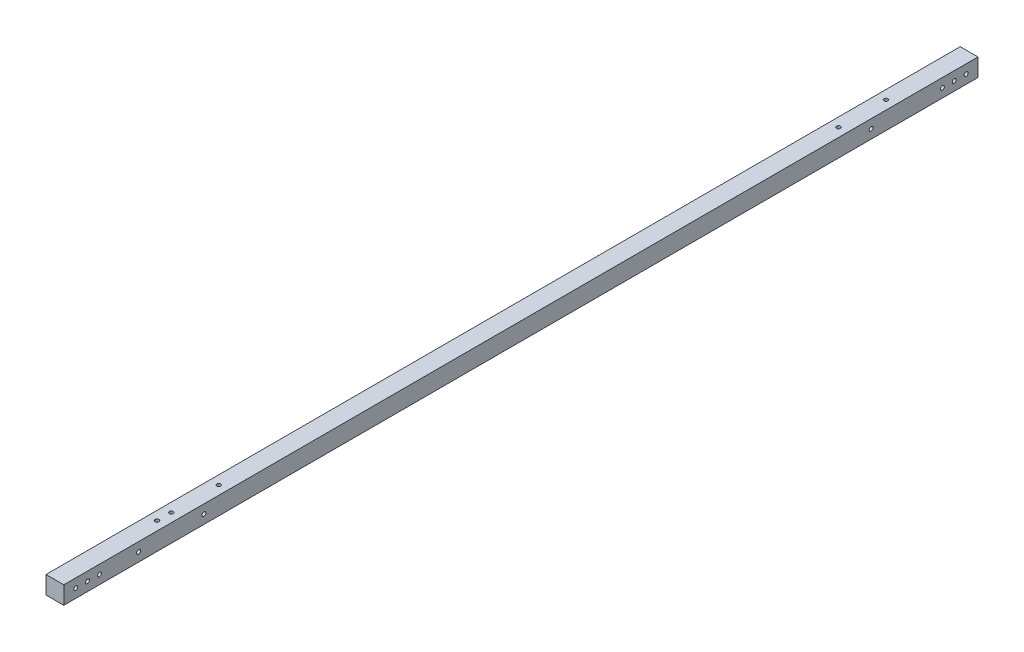
ISO-10303-21;
HEADER;
FILE_DESCRIPTION(('STEP AP214'),'2;1');
FILE_NAME('part.step','',(''),(''),'','','');
FILE_SCHEMA(('AUTOMOTIVE_DESIGN { 1 0 10303 214 1 1 1 1 }'));
ENDSEC;
DATA;
#1=APPLICATION_CONTEXT('core data for automotive mechanical design processes');
#2=APPLICATION_PROTOCOL_DEFINITION('international standard','automotive_design',2000,#1);
#3=PRODUCT_CONTEXT('',#1,'mechanical');
#4=PRODUCT('Part','Part','',(#3));
#5=PRODUCT_RELATED_PRODUCT_CATEGORY('part','',(#4));
#6=PRODUCT_DEFINITION_FORMATION('','',#4);
#7=PRODUCT_DEFINITION_CONTEXT('part definition',#1,'design');
#8=PRODUCT_DEFINITION('design','',#6,#7);
#9=PRODUCT_DEFINITION_SHAPE('','',#8);
#10=(LENGTH_UNIT() NAMED_UNIT(*) SI_UNIT(.MILLI.,.METRE.));
#11=(NAMED_UNIT(*) PLANE_ANGLE_UNIT() SI_UNIT($,.RADIAN.));
#12=(NAMED_UNIT(*) SI_UNIT($,.STERADIAN.) SOLID_ANGLE_UNIT());
#13=UNCERTAINTY_MEASURE_WITH_UNIT(LENGTH_MEASURE(1.E-05),#10,'distance_accuracy_value','');
#14=(GEOMETRIC_REPRESENTATION_CONTEXT(3) GLOBAL_UNCERTAINTY_ASSIGNED_CONTEXT((#13)) GLOBAL_UNIT_ASSIGNED_CONTEXT((#10,
#11,#12)) REPRESENTATION_CONTEXT('',''));
#15=CARTESIAN_POINT('',(0.,0.,0.));
#16=DIRECTION('',(0.,0.,1.));
#17=DIRECTION('',(1.,0.,0.));
#18=AXIS2_PLACEMENT_3D('',#15,#16,#17);
#19=CARTESIAN_POINT('',(7.5,-7.5,657.));
#20=DIRECTION('',(-1.,0.,0.));
#21=DIRECTION('',(0.,0.,1.));
#22=AXIS2_PLACEMENT_3D('',#19,#20,#21);
#23=PLANE('',#22);
#24=CARTESIAN_POINT('',(7.5,0.,-50.));
#25=DIRECTION('',(-1.,0.,0.));
#26=DIRECTION('',(0.,0.,1.));
#27=AXIS2_PLACEMENT_3D('',#24,#25,#26);
#28=CIRCLE('',#27,1.65);
#29=CARTESIAN_POINT('',(7.5,0.,-48.35));
#30=VERTEX_POINT('',#29);
#31=EDGE_CURVE('E111',#30,#30,#28,.T.);
#32=ORIENTED_EDGE('',*,*,#31,.T.);
#33=EDGE_LOOP('',(#32));
#34=FACE_BOUND('',#33,.T.);
#35=CARTESIAN_POINT('',(7.5,0.,-40.));
#36=DIRECTION('',(-1.,0.,0.));
#37=DIRECTION('',(0.,0.,1.));
#38=AXIS2_PLACEMENT_3D('',#35,#36,#37);
#39=CIRCLE('',#38,1.65);
#40=CARTESIAN_POINT('',(7.5,0.,-38.35));
#41=VERTEX_POINT('',#40);
#42=EDGE_CURVE('E114',#41,#41,#39,.T.);
#43=ORIENTED_EDGE('',*,*,#42,.T.);
#44=EDGE_LOOP('',(#43));
#45=FACE_BOUND('',#44,.T.);
#46=CARTESIAN_POINT('',(7.5,0.,-30.));
#47=DIRECTION('',(-1.,0.,0.));
#48=DIRECTION('',(0.,0.,1.));
#49=AXIS2_PLACEMENT_3D('',#46,#47,#48);
#50=CIRCLE('',#49,1.65);
#51=CARTESIAN_POINT('',(7.5,0.,-28.35));
#52=VERTEX_POINT('',#51);
#53=EDGE_CURVE('E232',#52,#52,#50,.T.);
#54=ORIENTED_EDGE('',*,*,#53,.T.);
#55=EDGE_LOOP('',(#54));
#56=FACE_BOUND('',#55,.T.);
#57=CARTESIAN_POINT('',(7.5,0.,680.));
#58=DIRECTION('',(-1.,0.,0.));
#59=DIRECTION('',(0.,0.,1.));
#60=AXIS2_PLACEMENT_3D('',#57,#58,#59);
#61=CIRCLE('',#60,1.65000000000005);
#62=CARTESIAN_POINT('',(7.5,0.,681.65));
#63=VERTEX_POINT('',#62);
#64=EDGE_CURVE('E237',#63,#63,#61,.T.);
#65=ORIENTED_EDGE('',*,*,#64,.T.);
#66=EDGE_LOOP('',(#65));
#67=FACE_BOUND('',#66,.T.);
#68=CARTESIAN_POINT('',(7.5,0.,690.));
#69=DIRECTION('',(-1.,0.,0.));
#70=DIRECTION('',(0.,0.,1.));
#71=AXIS2_PLACEMENT_3D('',#68,#69,#70);
#72=CIRCLE('',#71,1.65000000000005);
#73=CARTESIAN_POINT('',(7.5,0.,691.65));
#74=VERTEX_POINT('',#73);
#75=EDGE_CURVE('E243',#74,#74,#72,.T.);
#76=ORIENTED_EDGE('',*,*,#75,.T.);
#77=EDGE_LOOP('',(#76));
#78=FACE_BOUND('',#77,.T.);
#79=CARTESIAN_POINT('',(7.5,0.,700.));
#80=DIRECTION('',(-1.,0.,0.));
#81=DIRECTION('',(0.,0.,1.));
#82=AXIS2_PLACEMENT_3D('',#79,#80,#81);
#83=CIRCLE('',#82,1.65000000000005);
#84=CARTESIAN_POINT('',(7.5,0.,701.65));
#85=VERTEX_POINT('',#84);
#86=EDGE_CURVE('E250',#85,#85,#83,.T.);
#87=ORIENTED_EDGE('',*,*,#86,.T.);
#88=EDGE_LOOP('',(#87));
#89=FACE_BOUND('',#88,.T.);
#90=CARTESIAN_POINT('',(7.5,0.,647.));
#91=DIRECTION('',(1.,0.,0.));
#92=DIRECTION('',(0.,0.,-1.));
#93=AXIS2_PLACEMENT_3D('',#90,#91,#92);
#94=CIRCLE('',#93,1.65000000000005);
#95=CARTESIAN_POINT('',(7.5,0.,645.35));
#96=VERTEX_POINT('',#95);
#97=EDGE_CURVE('E134',#96,#96,#94,.T.);
#98=ORIENTED_EDGE('',*,*,#97,.F.);
#99=EDGE_LOOP('',(#98));
#100=FACE_BOUND('',#99,.T.);
#101=CARTESIAN_POINT('',(7.5,0.,592.));
#102=DIRECTION('',(1.,0.,0.));
#103=DIRECTION('',(0.,0.,-1.));
#104=AXIS2_PLACEMENT_3D('',#101,#102,#103);
#105=CIRCLE('',#104,1.65000000000005);
#106=CARTESIAN_POINT('',(7.5,0.,590.35));
#107=VERTEX_POINT('',#106);
#108=EDGE_CURVE('E137',#107,#107,#105,.T.);
#109=ORIENTED_EDGE('',*,*,#108,.F.);
#110=EDGE_LOOP('',(#109));
#111=FACE_BOUND('',#110,.T.);
#112=CARTESIAN_POINT('',(7.5,0.,30.));
#113=DIRECTION('',(1.,0.,0.));
#114=DIRECTION('',(0.,0.,-1.));
#115=AXIS2_PLACEMENT_3D('',#112,#113,#114);
#116=CIRCLE('',#115,1.65);
#117=CARTESIAN_POINT('',(7.5,0.,28.35));
#118=VERTEX_POINT('',#117);
#119=EDGE_CURVE('E132',#118,#118,#116,.T.);
#120=ORIENTED_EDGE('',*,*,#119,.F.);
#121=EDGE_LOOP('',(#120));
#122=FACE_BOUND('',#121,.T.);
#123=DIRECTION('',(0.,0.,-1.));
#124=VECTOR('',#123,1.);
#125=CARTESIAN_POINT('',(7.5,-7.5,657.));
#126=LINE('',#125,#124);
#127=CARTESIAN_POINT('',(7.5,-7.5,710.));
#128=VERTEX_POINT('',#127);
#129=CARTESIAN_POINT('',(7.5,-7.5,-60.));
#130=VERTEX_POINT('',#129);
#131=EDGE_CURVE('E90',#128,#130,#126,.T.);
#132=ORIENTED_EDGE('',*,*,#131,.T.);
#133=DIRECTION('',(0.,-1.,0.));
#134=VECTOR('',#133,1.);
#135=CARTESIAN_POINT('',(7.5,7.5,-60.));
#136=LINE('',#135,#134);
#137=CARTESIAN_POINT('',(7.5,7.5,-60.));
#138=VERTEX_POINT('',#137);
#139=EDGE_CURVE('E89',#138,#130,#136,.T.);
#140=ORIENTED_EDGE('',*,*,#139,.F.);
#141=DIRECTION('',(0.,0.,-1.));
#142=VECTOR('',#141,1.);
#143=CARTESIAN_POINT('',(7.5,7.5,657.));
#144=LINE('',#143,#142);
#145=CARTESIAN_POINT('',(7.5,7.5,710.));
#146=VERTEX_POINT('',#145);
#147=EDGE_CURVE('E11',#146,#138,#144,.T.);
#148=ORIENTED_EDGE('',*,*,#147,.F.);
#149=DIRECTION('',(0.,1.,0.));
#150=VECTOR('',#149,1.);
#151=CARTESIAN_POINT('',(7.5,-7.5,710.));
#152=LINE('',#151,#150);
#153=EDGE_CURVE('E91',#128,#146,#152,.T.);
#154=ORIENTED_EDGE('',*,*,#153,.F.);
#155=EDGE_LOOP('',(#132,#140,#148,#154));
#156=FACE_BOUND('',#155,.T.);
#157=ADVANCED_FACE('F42',(#34,#45,#56,#67,#78,#89,#100,#111,#122,#156),#23,.F.);
#158=CARTESIAN_POINT('',(-7.5,7.5,657.));
#159=DIRECTION('',(0.,-1.,0.));
#160=DIRECTION('',(0.,0.,-1.));
#161=AXIS2_PLACEMENT_3D('',#158,#159,#160);
#162=PLANE('',#161);
#163=CARTESIAN_POINT('',(0.,7.49999999999995,624.));
#164=DIRECTION('',(0.,-1.,0.));
#165=DIRECTION('',(0.,0.,-1.));
#166=AXIS2_PLACEMENT_3D('',#163,#164,#165);
#167=CIRCLE('',#166,1.65000000000002);
#168=CARTESIAN_POINT('',(0.,7.49999999999995,622.35));
#169=VERTEX_POINT('',#168);
#170=EDGE_CURVE('E97',#169,#169,#167,.T.);
#171=ORIENTED_EDGE('',*,*,#170,.T.);
#172=EDGE_LOOP('',(#171));
#173=FACE_BOUND('',#172,.T.);
#174=CARTESIAN_POINT('',(0.,7.49999999999995,612.));
#175=DIRECTION('',(0.,-1.,0.));
#176=DIRECTION('',(0.,0.,-1.));
#177=AXIS2_PLACEMENT_3D('',#174,#175,#176);
#178=CIRCLE('',#177,1.65000000000002);
#179=CARTESIAN_POINT('',(0.,7.49999999999995,610.35));
#180=VERTEX_POINT('',#179);
#181=EDGE_CURVE('E177',#180,#180,#178,.T.);
#182=ORIENTED_EDGE('',*,*,#181,.T.);
#183=EDGE_LOOP('',(#182));
#184=FACE_BOUND('',#183,.T.);
#185=CARTESIAN_POINT('',(0.,7.49999999999995,572.));
#186=DIRECTION('',(0.,-1.,0.));
#187=DIRECTION('',(0.,0.,-1.));
#188=AXIS2_PLACEMENT_3D('',#185,#186,#187);
#189=CIRCLE('',#188,1.65000000000002);
#190=CARTESIAN_POINT('',(0.,7.49999999999995,570.35));
#191=VERTEX_POINT('',#190);
#192=EDGE_CURVE('E174',#191,#191,#189,.T.);
#193=ORIENTED_EDGE('',*,*,#192,.T.);
#194=EDGE_LOOP('',(#193));
#195=FACE_BOUND('',#194,.T.);
#196=CARTESIAN_POINT('',(0.,7.49999999999995,10.));
#197=DIRECTION('',(0.,-1.,0.));
#198=DIRECTION('',(0.,0.,-1.));
#199=AXIS2_PLACEMENT_3D('',#196,#197,#198);
#200=CIRCLE('',#199,1.65);
#201=CARTESIAN_POINT('',(0.,7.49999999999995,8.35000000000001));
#202=VERTEX_POINT('',#201);
#203=EDGE_CURVE('E171',#202,#202,#200,.T.);
#204=ORIENTED_EDGE('',*,*,#203,.T.);
#205=EDGE_LOOP('',(#204));
#206=FACE_BOUND('',#205,.T.);
#207=CARTESIAN_POINT('',(0.,7.49999999999995,50.));
#208=DIRECTION('',(0.,-1.,0.));
#209=DIRECTION('',(0.,0.,-1.));
#210=AXIS2_PLACEMENT_3D('',#207,#208,#209);
#211=CIRCLE('',#210,1.65);
#212=CARTESIAN_POINT('',(0.,7.49999999999995,48.35));
#213=VERTEX_POINT('',#212);
#214=EDGE_CURVE('E151',#213,#213,#211,.T.);
#215=ORIENTED_EDGE('',*,*,#214,.T.);
#216=EDGE_LOOP('',(#215));
#217=FACE_BOUND('',#216,.T.);
#218=ORIENTED_EDGE('',*,*,#147,.T.);
#219=DIRECTION('',(1.,0.,0.));
#220=VECTOR('',#219,1.);
#221=CARTESIAN_POINT('',(-7.5,7.5,-60.));
#222=LINE('',#221,#220);
#223=CARTESIAN_POINT('',(-7.5,7.5,-60.));
#224=VERTEX_POINT('',#223);
#225=EDGE_CURVE('E107',#224,#138,#222,.T.);
#226=ORIENTED_EDGE('',*,*,#225,.F.);
#227=DIRECTION('',(0.,0.,-1.));
#228=VECTOR('',#227,1.);
#229=CARTESIAN_POINT('',(-7.5,7.5,657.));
#230=LINE('',#229,#228);
#231=CARTESIAN_POINT('',(-7.5,7.5,710.));
#232=VERTEX_POINT('',#231);
#233=EDGE_CURVE('E52',#232,#224,#230,.T.);
#234=ORIENTED_EDGE('',*,*,#233,.F.);
#235=DIRECTION('',(-1.,0.,0.));
#236=VECTOR('',#235,1.);
#237=CARTESIAN_POINT('',(7.5,7.5,710.));
#238=LINE('',#237,#236);
#239=EDGE_CURVE('E130',#146,#232,#238,.T.);
#240=ORIENTED_EDGE('',*,*,#239,.F.);
#241=EDGE_LOOP('',(#218,#226,#234,#240));
#242=FACE_BOUND('',#241,.T.);
#243=ADVANCED_FACE('F217',(#173,#184,#195,#206,#217,#242),#162,.F.);
#244=CARTESIAN_POINT('',(-7.5,-7.5,657.));
#245=DIRECTION('',(1.,0.,0.));
#246=DIRECTION('',(0.,0.,-1.));
#247=AXIS2_PLACEMENT_3D('',#244,#245,#246);
#248=PLANE('',#247);
#249=CARTESIAN_POINT('',(-7.5,0.,-50.));
#250=DIRECTION('',(-1.,0.,0.));
#251=DIRECTION('',(0.,0.,1.));
#252=AXIS2_PLACEMENT_3D('',#249,#250,#251);
#253=CIRCLE('',#252,1.65);
#254=CARTESIAN_POINT('',(-7.5,0.,-48.35));
#255=VERTEX_POINT('',#254);
#256=EDGE_CURVE('E481',#255,#255,#253,.T.);
#257=ORIENTED_EDGE('',*,*,#256,.F.);
#258=EDGE_LOOP('',(#257));
#259=FACE_BOUND('',#258,.T.);
#260=CARTESIAN_POINT('',(-7.5,0.,-40.));
#261=DIRECTION('',(-1.,0.,0.));
#262=DIRECTION('',(0.,0.,1.));
#263=AXIS2_PLACEMENT_3D('',#260,#261,#262);
#264=CIRCLE('',#263,1.65);
#265=CARTESIAN_POINT('',(-7.5,0.,-38.35));
#266=VERTEX_POINT('',#265);
#267=EDGE_CURVE('E483',#266,#266,#264,.T.);
#268=ORIENTED_EDGE('',*,*,#267,.F.);
#269=EDGE_LOOP('',(#268));
#270=FACE_BOUND('',#269,.T.);
#271=CARTESIAN_POINT('',(-7.5,0.,-30.));
#272=DIRECTION('',(-1.,0.,0.));
#273=DIRECTION('',(0.,0.,1.));
#274=AXIS2_PLACEMENT_3D('',#271,#272,#273);
#275=CIRCLE('',#274,1.65);
#276=CARTESIAN_POINT('',(-7.5,0.,-28.35));
#277=VERTEX_POINT('',#276);
#278=EDGE_CURVE('E489',#277,#277,#275,.T.);
#279=ORIENTED_EDGE('',*,*,#278,.F.);
#280=EDGE_LOOP('',(#279));
#281=FACE_BOUND('',#280,.T.);
#282=CARTESIAN_POINT('',(-7.5,0.,680.));
#283=DIRECTION('',(-1.,0.,0.));
#284=DIRECTION('',(0.,0.,1.));
#285=AXIS2_PLACEMENT_3D('',#282,#283,#284);
#286=CIRCLE('',#285,1.65000000000005);
#287=CARTESIAN_POINT('',(-7.5,0.,681.65));
#288=VERTEX_POINT('',#287);
#289=EDGE_CURVE('E496',#288,#288,#286,.T.);
#290=ORIENTED_EDGE('',*,*,#289,.F.);
#291=EDGE_LOOP('',(#290));
#292=FACE_BOUND('',#291,.T.);
#293=CARTESIAN_POINT('',(-7.5,0.,690.));
#294=DIRECTION('',(-1.,0.,0.));
#295=DIRECTION('',(0.,0.,1.));
#296=AXIS2_PLACEMENT_3D('',#293,#294,#295);
#297=CIRCLE('',#296,1.65000000000005);
#298=CARTESIAN_POINT('',(-7.5,0.,691.65));
#299=VERTEX_POINT('',#298);
#300=EDGE_CURVE('E499',#299,#299,#297,.T.);
#301=ORIENTED_EDGE('',*,*,#300,.F.);
#302=EDGE_LOOP('',(#301));
#303=FACE_BOUND('',#302,.T.);
#304=CARTESIAN_POINT('',(-7.5,0.,700.));
#305=DIRECTION('',(-1.,0.,0.));
#306=DIRECTION('',(0.,0.,1.));
#307=AXIS2_PLACEMENT_3D('',#304,#305,#306);
#308=CIRCLE('',#307,1.65000000000005);
#309=CARTESIAN_POINT('',(-7.5,0.,701.65));
#310=VERTEX_POINT('',#309);
#311=EDGE_CURVE('E502',#310,#310,#308,.T.);
#312=ORIENTED_EDGE('',*,*,#311,.F.);
#313=EDGE_LOOP('',(#312));
#314=FACE_BOUND('',#313,.T.);
#315=CARTESIAN_POINT('',(-7.5,0.,647.));
#316=DIRECTION('',(1.,0.,0.));
#317=DIRECTION('',(0.,0.,-1.));
#318=AXIS2_PLACEMENT_3D('',#315,#316,#317);
#319=CIRCLE('',#318,1.65000000000005);
#320=CARTESIAN_POINT('',(-7.5,0.,645.35));
#321=VERTEX_POINT('',#320);
#322=EDGE_CURVE('E50',#321,#321,#319,.T.);
#323=ORIENTED_EDGE('',*,*,#322,.T.);
#324=EDGE_LOOP('',(#323));
#325=FACE_BOUND('',#324,.T.);
#326=CARTESIAN_POINT('',(-7.5,0.,592.));
#327=DIRECTION('',(1.,0.,0.));
#328=DIRECTION('',(0.,0.,-1.));
#329=AXIS2_PLACEMENT_3D('',#326,#327,#328);
#330=CIRCLE('',#329,1.65000000000005);
#331=CARTESIAN_POINT('',(-7.5,0.,590.35));
#332=VERTEX_POINT('',#331);
#333=EDGE_CURVE('E191',#332,#332,#330,.T.);
#334=ORIENTED_EDGE('',*,*,#333,.T.);
#335=EDGE_LOOP('',(#334));
#336=FACE_BOUND('',#335,.T.);
#337=CARTESIAN_POINT('',(-7.5,0.,30.));
#338=DIRECTION('',(1.,0.,0.));
#339=DIRECTION('',(0.,0.,-1.));
#340=AXIS2_PLACEMENT_3D('',#337,#338,#339);
#341=CIRCLE('',#340,1.65);
#342=CARTESIAN_POINT('',(-7.5,0.,28.35));
#343=VERTEX_POINT('',#342);
#344=EDGE_CURVE('E138',#343,#343,#341,.T.);
#345=ORIENTED_EDGE('',*,*,#344,.T.);
#346=EDGE_LOOP('',(#345));
#347=FACE_BOUND('',#346,.T.);
#348=ORIENTED_EDGE('',*,*,#233,.T.);
#349=DIRECTION('',(0.,1.,0.));
#350=VECTOR('',#349,1.);
#351=CARTESIAN_POINT('',(-7.5,-7.5,-60.));
#352=LINE('',#351,#350);
#353=CARTESIAN_POINT('',(-7.5,-7.5,-60.));
#354=VERTEX_POINT('',#353);
#355=EDGE_CURVE('E102',#354,#224,#352,.T.);
#356=ORIENTED_EDGE('',*,*,#355,.F.);
#357=DIRECTION('',(0.,0.,-1.));
#358=VECTOR('',#357,1.);
#359=CARTESIAN_POINT('',(-7.5,-7.5,657.));
#360=LINE('',#359,#358);
#361=CARTESIAN_POINT('',(-7.5,-7.5,710.));
#362=VERTEX_POINT('',#361);
#363=EDGE_CURVE('E64',#362,#354,#360,.T.);
#364=ORIENTED_EDGE('',*,*,#363,.F.);
#365=DIRECTION('',(0.,-1.,0.));
#366=VECTOR('',#365,1.);
#367=CARTESIAN_POINT('',(-7.5,7.5,710.));
#368=LINE('',#367,#366);
#369=EDGE_CURVE('E131',#232,#362,#368,.T.);
#370=ORIENTED_EDGE('',*,*,#369,.F.);
#371=EDGE_LOOP('',(#348,#356,#364,#370));
#372=FACE_BOUND('',#371,.T.);
#373=ADVANCED_FACE('F204',(#259,#270,#281,#292,#303,#314,#325,#336,#347,#372),#248,.F.);
#374=CARTESIAN_POINT('',(-7.5,-7.5,657.));
#375=DIRECTION('',(0.,1.,0.));
#376=DIRECTION('',(0.,0.,1.));
#377=AXIS2_PLACEMENT_3D('',#374,#375,#376);
#378=PLANE('',#377);
#379=CARTESIAN_POINT('',(0.,-7.5,624.));
#380=DIRECTION('',(0.,-1.,0.));
#381=DIRECTION('',(0.,0.,-1.));
#382=AXIS2_PLACEMENT_3D('',#379,#380,#381);
#383=CIRCLE('',#382,1.65000000000002);
#384=CARTESIAN_POINT('',(0.,-7.5,622.35));
#385=VERTEX_POINT('',#384);
#386=EDGE_CURVE('E146',#385,#385,#383,.T.);
#387=ORIENTED_EDGE('',*,*,#386,.F.);
#388=EDGE_LOOP('',(#387));
#389=FACE_BOUND('',#388,.T.);
#390=CARTESIAN_POINT('',(0.,-7.5,612.));
#391=DIRECTION('',(0.,-1.,0.));
#392=DIRECTION('',(0.,0.,-1.));
#393=AXIS2_PLACEMENT_3D('',#390,#391,#392);
#394=CIRCLE('',#393,1.65000000000002);
#395=CARTESIAN_POINT('',(0.,-7.5,610.35));
#396=VERTEX_POINT('',#395);
#397=EDGE_CURVE('E155',#396,#396,#394,.T.);
#398=ORIENTED_EDGE('',*,*,#397,.F.);
#399=EDGE_LOOP('',(#398));
#400=FACE_BOUND('',#399,.T.);
#401=CARTESIAN_POINT('',(0.,-7.5,572.));
#402=DIRECTION('',(0.,-1.,0.));
#403=DIRECTION('',(0.,0.,-1.));
#404=AXIS2_PLACEMENT_3D('',#401,#402,#403);
#405=CIRCLE('',#404,1.65000000000002);
#406=CARTESIAN_POINT('',(0.,-7.5,570.35));
#407=VERTEX_POINT('',#406);
#408=EDGE_CURVE('E159',#407,#407,#405,.T.);
#409=ORIENTED_EDGE('',*,*,#408,.F.);
#410=EDGE_LOOP('',(#409));
#411=FACE_BOUND('',#410,.T.);
#412=CARTESIAN_POINT('',(0.,-7.5,10.));
#413=DIRECTION('',(0.,-1.,0.));
#414=DIRECTION('',(0.,0.,-1.));
#415=AXIS2_PLACEMENT_3D('',#412,#413,#414);
#416=CIRCLE('',#415,1.65);
#417=CARTESIAN_POINT('',(0.,-7.5,8.35000000000001));
#418=VERTEX_POINT('',#417);
#419=EDGE_CURVE('E157',#418,#418,#416,.T.);
#420=ORIENTED_EDGE('',*,*,#419,.F.);
#421=EDGE_LOOP('',(#420));
#422=FACE_BOUND('',#421,.T.);
#423=CARTESIAN_POINT('',(0.,-7.5,50.));
#424=DIRECTION('',(0.,-1.,0.));
#425=DIRECTION('',(0.,0.,-1.));
#426=AXIS2_PLACEMENT_3D('',#423,#424,#425);
#427=CIRCLE('',#426,1.65);
#428=CARTESIAN_POINT('',(0.,-7.5,48.35));
#429=VERTEX_POINT('',#428);
#430=EDGE_CURVE('E165',#429,#429,#427,.T.);
#431=ORIENTED_EDGE('',*,*,#430,.F.);
#432=EDGE_LOOP('',(#431));
#433=FACE_BOUND('',#432,.T.);
#434=ORIENTED_EDGE('',*,*,#363,.T.);
#435=DIRECTION('',(-1.,0.,0.));
#436=VECTOR('',#435,1.);
#437=CARTESIAN_POINT('',(7.5,-7.5,-60.));
#438=LINE('',#437,#436);
#439=EDGE_CURVE('E99',#130,#354,#438,.T.);
#440=ORIENTED_EDGE('',*,*,#439,.F.);
#441=ORIENTED_EDGE('',*,*,#131,.F.);
#442=DIRECTION('',(1.,0.,0.));
#443=VECTOR('',#442,1.);
#444=CARTESIAN_POINT('',(-7.5,-7.5,710.));
#445=LINE('',#444,#443);
#446=EDGE_CURVE('E124',#362,#128,#445,.T.);
#447=ORIENTED_EDGE('',*,*,#446,.F.);
#448=EDGE_LOOP('',(#434,#440,#441,#447));
#449=FACE_BOUND('',#448,.T.);
#450=ADVANCED_FACE('F103',(#389,#400,#411,#422,#433,#449),#378,.F.);
#451=CARTESIAN_POINT('',(0.,992.5,50.));
#452=DIRECTION('',(0.,-1.,0.));
#453=DIRECTION('',(0.,0.,-1.));
#454=AXIS2_PLACEMENT_3D('',#451,#452,#453);
#455=CYLINDRICAL_SURFACE('',#454,1.65);
#456=ORIENTED_EDGE('',*,*,#430,.T.);
#457=EDGE_LOOP('',(#456));
#458=FACE_BOUND('',#457,.T.);
#459=ORIENTED_EDGE('',*,*,#214,.F.);
#460=EDGE_LOOP('',(#459));
#461=FACE_BOUND('',#460,.T.);
#462=ADVANCED_FACE('F269',(#458,#461),#455,.F.);
#463=CARTESIAN_POINT('',(0.,992.5,10.));
#464=DIRECTION('',(0.,-1.,0.));
#465=DIRECTION('',(0.,0.,-1.));
#466=AXIS2_PLACEMENT_3D('',#463,#464,#465);
#467=CYLINDRICAL_SURFACE('',#466,1.65);
#468=ORIENTED_EDGE('',*,*,#419,.T.);
#469=EDGE_LOOP('',(#468));
#470=FACE_BOUND('',#469,.T.);
#471=ORIENTED_EDGE('',*,*,#203,.F.);
#472=EDGE_LOOP('',(#471));
#473=FACE_BOUND('',#472,.T.);
#474=ADVANCED_FACE('F274',(#470,#473),#467,.F.);
#475=CARTESIAN_POINT('',(0.,992.5,572.));
#476=DIRECTION('',(0.,-1.,0.));
#477=DIRECTION('',(0.,0.,-1.));
#478=AXIS2_PLACEMENT_3D('',#475,#476,#477);
#479=CYLINDRICAL_SURFACE('',#478,1.65000000000002);
#480=ORIENTED_EDGE('',*,*,#408,.T.);
#481=EDGE_LOOP('',(#480));
#482=FACE_BOUND('',#481,.T.);
#483=ORIENTED_EDGE('',*,*,#192,.F.);
#484=EDGE_LOOP('',(#483));
#485=FACE_BOUND('',#484,.T.);
#486=ADVANCED_FACE('F280',(#482,#485),#479,.F.);
#487=CARTESIAN_POINT('',(0.,992.5,612.));
#488=DIRECTION('',(0.,-1.,0.));
#489=DIRECTION('',(0.,0.,-1.));
#490=AXIS2_PLACEMENT_3D('',#487,#488,#489);
#491=CYLINDRICAL_SURFACE('',#490,1.65000000000002);
#492=ORIENTED_EDGE('',*,*,#397,.T.);
#493=EDGE_LOOP('',(#492));
#494=FACE_BOUND('',#493,.T.);
#495=ORIENTED_EDGE('',*,*,#181,.F.);
#496=EDGE_LOOP('',(#495));
#497=FACE_BOUND('',#496,.T.);
#498=ADVANCED_FACE('F285',(#494,#497),#491,.F.);
#499=CARTESIAN_POINT('',(0.,992.5,624.));
#500=DIRECTION('',(0.,-1.,0.));
#501=DIRECTION('',(0.,0.,-1.));
#502=AXIS2_PLACEMENT_3D('',#499,#500,#501);
#503=CYLINDRICAL_SURFACE('',#502,1.65000000000002);
#504=ORIENTED_EDGE('',*,*,#386,.T.);
#505=EDGE_LOOP('',(#504));
#506=FACE_BOUND('',#505,.T.);
#507=ORIENTED_EDGE('',*,*,#170,.F.);
#508=EDGE_LOOP('',(#507));
#509=FACE_BOUND('',#508,.T.);
#510=ADVANCED_FACE('F259',(#506,#509),#503,.F.);
#511=CARTESIAN_POINT('',(-12.5,0.,30.));
#512=DIRECTION('',(1.,0.,0.));
#513=DIRECTION('',(0.,0.,-1.));
#514=AXIS2_PLACEMENT_3D('',#511,#512,#513);
#515=CYLINDRICAL_SURFACE('',#514,1.65);
#516=ORIENTED_EDGE('',*,*,#119,.T.);
#517=EDGE_LOOP('',(#516));
#518=FACE_BOUND('',#517,.T.);
#519=ORIENTED_EDGE('',*,*,#344,.F.);
#520=EDGE_LOOP('',(#519));
#521=FACE_BOUND('',#520,.T.);
#522=ADVANCED_FACE('F212',(#518,#521),#515,.F.);
#523=CARTESIAN_POINT('',(-12.5,0.,592.));
#524=DIRECTION('',(1.,0.,0.));
#525=DIRECTION('',(0.,0.,-1.));
#526=AXIS2_PLACEMENT_3D('',#523,#524,#525);
#527=CYLINDRICAL_SURFACE('',#526,1.65000000000005);
#528=ORIENTED_EDGE('',*,*,#108,.T.);
#529=EDGE_LOOP('',(#528));
#530=FACE_BOUND('',#529,.T.);
#531=ORIENTED_EDGE('',*,*,#333,.F.);
#532=EDGE_LOOP('',(#531));
#533=FACE_BOUND('',#532,.T.);
#534=ADVANCED_FACE('F207',(#530,#533),#527,.F.);
#535=CARTESIAN_POINT('',(-12.5,0.,647.));
#536=DIRECTION('',(1.,0.,0.));
#537=DIRECTION('',(0.,0.,-1.));
#538=AXIS2_PLACEMENT_3D('',#535,#536,#537);
#539=CYLINDRICAL_SURFACE('',#538,1.65000000000005);
#540=ORIENTED_EDGE('',*,*,#97,.T.);
#541=EDGE_LOOP('',(#540));
#542=FACE_BOUND('',#541,.T.);
#543=ORIENTED_EDGE('',*,*,#322,.F.);
#544=EDGE_LOOP('',(#543));
#545=FACE_BOUND('',#544,.T.);
#546=ADVANCED_FACE('F205',(#542,#545),#539,.F.);
#547=CARTESIAN_POINT('',(0.,0.,710.));
#548=DIRECTION('',(0.,0.,1.));
#549=DIRECTION('',(1.,0.,0.));
#550=AXIS2_PLACEMENT_3D('',#547,#548,#549);
#551=PLANE('',#550);
#552=ORIENTED_EDGE('',*,*,#446,.T.);
#553=ORIENTED_EDGE('',*,*,#153,.T.);
#554=ORIENTED_EDGE('',*,*,#239,.T.);
#555=ORIENTED_EDGE('',*,*,#369,.T.);
#556=EDGE_LOOP('',(#552,#553,#554,#555));
#557=FACE_BOUND('',#556,.T.);
#558=ADVANCED_FACE('F202',(#557),#551,.T.);
#559=CARTESIAN_POINT('',(0.,0.,-60.));
#560=DIRECTION('',(0.,0.,-1.));
#561=DIRECTION('',(-1.,0.,0.));
#562=AXIS2_PLACEMENT_3D('',#559,#560,#561);
#563=PLANE('',#562);
#564=ORIENTED_EDGE('',*,*,#139,.T.);
#565=ORIENTED_EDGE('',*,*,#439,.T.);
#566=ORIENTED_EDGE('',*,*,#355,.T.);
#567=ORIENTED_EDGE('',*,*,#225,.T.);
#568=EDGE_LOOP('',(#564,#565,#566,#567));
#569=FACE_BOUND('',#568,.T.);
#570=ADVANCED_FACE('F108',(#569),#563,.T.);
#571=CARTESIAN_POINT('',(12.5,0.,700.));
#572=DIRECTION('',(-1.,0.,0.));
#573=DIRECTION('',(0.,0.,1.));
#574=AXIS2_PLACEMENT_3D('',#571,#572,#573);
#575=CYLINDRICAL_SURFACE('',#574,1.65000000000005);
#576=ORIENTED_EDGE('',*,*,#311,.T.);
#577=EDGE_LOOP('',(#576));
#578=FACE_BOUND('',#577,.T.);
#579=ORIENTED_EDGE('',*,*,#86,.F.);
#580=EDGE_LOOP('',(#579));
#581=FACE_BOUND('',#580,.T.);
#582=ADVANCED_FACE('F419',(#578,#581),#575,.F.);
#583=CARTESIAN_POINT('',(12.5,0.,690.));
#584=DIRECTION('',(-1.,0.,0.));
#585=DIRECTION('',(0.,0.,1.));
#586=AXIS2_PLACEMENT_3D('',#583,#584,#585);
#587=CYLINDRICAL_SURFACE('',#586,1.65000000000005);
#588=ORIENTED_EDGE('',*,*,#300,.T.);
#589=EDGE_LOOP('',(#588));
#590=FACE_BOUND('',#589,.T.);
#591=ORIENTED_EDGE('',*,*,#75,.F.);
#592=EDGE_LOOP('',(#591));
#593=FACE_BOUND('',#592,.T.);
#594=ADVANCED_FACE('F430',(#590,#593),#587,.F.);
#595=CARTESIAN_POINT('',(12.5,0.,680.));
#596=DIRECTION('',(-1.,0.,0.));
#597=DIRECTION('',(0.,0.,1.));
#598=AXIS2_PLACEMENT_3D('',#595,#596,#597);
#599=CYLINDRICAL_SURFACE('',#598,1.65000000000005);
#600=ORIENTED_EDGE('',*,*,#289,.T.);
#601=EDGE_LOOP('',(#600));
#602=FACE_BOUND('',#601,.T.);
#603=ORIENTED_EDGE('',*,*,#64,.F.);
#604=EDGE_LOOP('',(#603));
#605=FACE_BOUND('',#604,.T.);
#606=ADVANCED_FACE('F440',(#602,#605),#599,.F.);
#607=CARTESIAN_POINT('',(12.5,0.,-30.));
#608=DIRECTION('',(-1.,0.,0.));
#609=DIRECTION('',(0.,0.,1.));
#610=AXIS2_PLACEMENT_3D('',#607,#608,#609);
#611=CYLINDRICAL_SURFACE('',#610,1.65);
#612=ORIENTED_EDGE('',*,*,#278,.T.);
#613=EDGE_LOOP('',(#612));
#614=FACE_BOUND('',#613,.T.);
#615=ORIENTED_EDGE('',*,*,#53,.F.);
#616=EDGE_LOOP('',(#615));
#617=FACE_BOUND('',#616,.T.);
#618=ADVANCED_FACE('F450',(#614,#617),#611,.F.);
#619=CARTESIAN_POINT('',(12.5,0.,-40.));
#620=DIRECTION('',(-1.,0.,0.));
#621=DIRECTION('',(0.,0.,1.));
#622=AXIS2_PLACEMENT_3D('',#619,#620,#621);
#623=CYLINDRICAL_SURFACE('',#622,1.65);
#624=ORIENTED_EDGE('',*,*,#267,.T.);
#625=EDGE_LOOP('',(#624));
#626=FACE_BOUND('',#625,.T.);
#627=ORIENTED_EDGE('',*,*,#42,.F.);
#628=EDGE_LOOP('',(#627));
#629=FACE_BOUND('',#628,.T.);
#630=ADVANCED_FACE('F460',(#626,#629),#623,.F.);
#631=CARTESIAN_POINT('',(12.5,0.,-50.));
#632=DIRECTION('',(-1.,0.,0.));
#633=DIRECTION('',(0.,0.,1.));
#634=AXIS2_PLACEMENT_3D('',#631,#632,#633);
#635=CYLINDRICAL_SURFACE('',#634,1.65);
#636=ORIENTED_EDGE('',*,*,#256,.T.);
#637=EDGE_LOOP('',(#636));
#638=FACE_BOUND('',#637,.T.);
#639=ORIENTED_EDGE('',*,*,#31,.F.);
#640=EDGE_LOOP('',(#639));
#641=FACE_BOUND('',#640,.T.);
#642=ADVANCED_FACE('F470',(#638,#641),#635,.F.);
#643=CLOSED_SHELL('',(#157,#243,#373,#450,#462,#474,#486,#498,#510,#522,#534,#546,#558,#570,
#582,#594,#606,#618,#630,#642));
#644=MANIFOLD_SOLID_BREP('B2',#643);
#645=ADVANCED_BREP_SHAPE_REPRESENTATION('',(#18,#644),#14);
#646=SHAPE_DEFINITION_REPRESENTATION(#9,#645);
ENDSEC;
END-ISO-10303-21;
